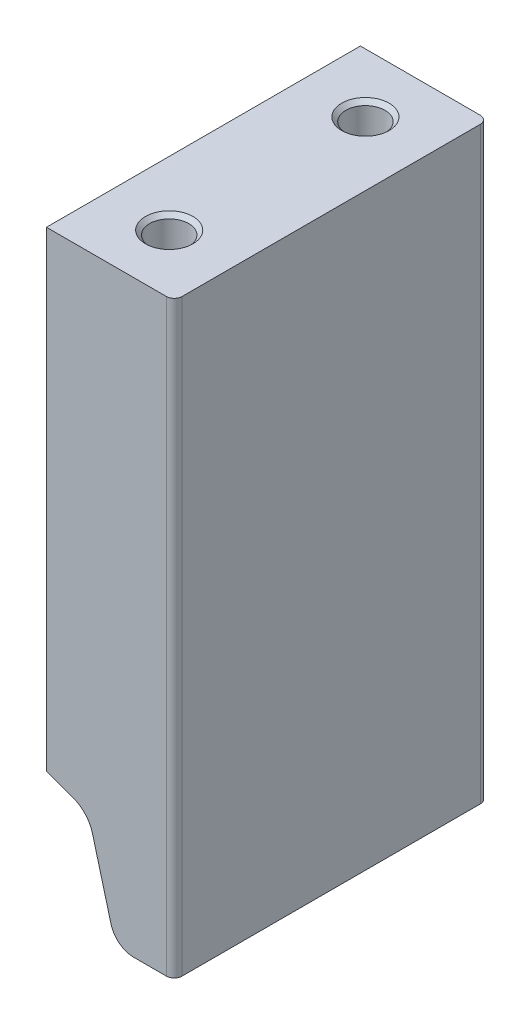
ISO-10303-21;
HEADER;
FILE_DESCRIPTION(('STEP AP214'),'2;1');
FILE_NAME('part.step','',(''),(''),'','','');
FILE_SCHEMA(('AUTOMOTIVE_DESIGN { 1 0 10303 214 1 1 1 1 }'));
ENDSEC;
DATA;
#1=APPLICATION_CONTEXT('core data for automotive mechanical design processes');
#2=APPLICATION_PROTOCOL_DEFINITION('international standard','automotive_design',2000,#1);
#3=PRODUCT_CONTEXT('',#1,'mechanical');
#4=PRODUCT('Part','Part','',(#3));
#5=PRODUCT_RELATED_PRODUCT_CATEGORY('part','',(#4));
#6=PRODUCT_DEFINITION_FORMATION('','',#4);
#7=PRODUCT_DEFINITION_CONTEXT('part definition',#1,'design');
#8=PRODUCT_DEFINITION('design','',#6,#7);
#9=PRODUCT_DEFINITION_SHAPE('','',#8);
#10=(LENGTH_UNIT() NAMED_UNIT(*) SI_UNIT(.MILLI.,.METRE.));
#11=(NAMED_UNIT(*) PLANE_ANGLE_UNIT() SI_UNIT($,.RADIAN.));
#12=(NAMED_UNIT(*) SI_UNIT($,.STERADIAN.) SOLID_ANGLE_UNIT());
#13=UNCERTAINTY_MEASURE_WITH_UNIT(LENGTH_MEASURE(1.E-05),#10,'distance_accuracy_value','');
#14=(GEOMETRIC_REPRESENTATION_CONTEXT(3) GLOBAL_UNCERTAINTY_ASSIGNED_CONTEXT((#13)) GLOBAL_UNIT_ASSIGNED_CONTEXT((#10,
#11,#12)) REPRESENTATION_CONTEXT('',''));
#15=CARTESIAN_POINT('',(0.,0.,0.));
#16=DIRECTION('',(0.,0.,1.));
#17=DIRECTION('',(1.,0.,0.));
#18=AXIS2_PLACEMENT_3D('',#15,#16,#17);
#19=CARTESIAN_POINT('',(8.14,-75.,20.));
#20=DIRECTION('',(1.,0.,0.));
#21=DIRECTION('',(0.,0.,-1.));
#22=AXIS2_PLACEMENT_3D('',#19,#20,#21);
#23=PLANE('',#22);
#24=DIRECTION('',(0.,0.,-1.));
#25=VECTOR('',#24,1.);
#26=CARTESIAN_POINT('',(8.14,-75.,20.));
#27=LINE('',#26,#25);
#28=CARTESIAN_POINT('',(8.14,-75.,19.));
#29=VERTEX_POINT('',#28);
#30=CARTESIAN_POINT('',(8.14,-75.,-19.));
#31=VERTEX_POINT('',#30);
#32=EDGE_CURVE('E215',#29,#31,#27,.T.);
#33=ORIENTED_EDGE('',*,*,#32,.T.);
#34=DIRECTION('',(0.,1.,0.));
#35=VECTOR('',#34,1.);
#36=CARTESIAN_POINT('',(8.14,-75.,-19.));
#37=LINE('',#36,#35);
#38=CARTESIAN_POINT('',(8.14,0.,-19.));
#39=VERTEX_POINT('',#38);
#40=EDGE_CURVE('E263',#31,#39,#37,.T.);
#41=ORIENTED_EDGE('',*,*,#40,.T.);
#42=DIRECTION('',(0.,0.,-1.));
#43=VECTOR('',#42,1.);
#44=CARTESIAN_POINT('',(8.14,0.,20.));
#45=LINE('',#44,#43);
#46=CARTESIAN_POINT('',(8.14,0.,19.));
#47=VERTEX_POINT('',#46);
#48=EDGE_CURVE('E208',#47,#39,#45,.T.);
#49=ORIENTED_EDGE('',*,*,#48,.F.);
#50=DIRECTION('',(0.,1.,0.));
#51=VECTOR('',#50,1.);
#52=CARTESIAN_POINT('',(8.14,-75.,19.));
#53=LINE('',#52,#51);
#54=EDGE_CURVE('E260',#47,#29,#53,.F.);
#55=ORIENTED_EDGE('',*,*,#54,.T.);
#56=EDGE_LOOP('',(#33,#41,#49,#55));
#57=FACE_BOUND('',#56,.T.);
#58=ADVANCED_FACE('F65',(#57),#23,.T.);
#59=CARTESIAN_POINT('',(-8.14,-75.,20.));
#60=DIRECTION('',(0.,0.,1.));
#61=DIRECTION('',(1.,0.,0.));
#62=AXIS2_PLACEMENT_3D('',#59,#60,#61);
#63=PLANE('',#62);
#64=DIRECTION('',(1.,0.,0.));
#65=VECTOR('',#64,1.);
#66=CARTESIAN_POINT('',(-8.14,-75.,20.));
#67=LINE('',#66,#65);
#68=CARTESIAN_POINT('',(2.98257760988845,-75.,20.));
#69=VERTEX_POINT('',#68);
#70=CARTESIAN_POINT('',(7.14,-75.,20.));
#71=VERTEX_POINT('',#70);
#72=EDGE_CURVE('E223',#69,#71,#67,.T.);
#73=ORIENTED_EDGE('',*,*,#72,.T.);
#74=DIRECTION('',(0.,1.,0.));
#75=VECTOR('',#74,1.);
#76=CARTESIAN_POINT('',(7.14,-75.,20.));
#77=LINE('',#76,#75);
#78=CARTESIAN_POINT('',(7.14,0.,20.));
#79=VERTEX_POINT('',#78);
#80=EDGE_CURVE('E13',#71,#79,#77,.T.);
#81=ORIENTED_EDGE('',*,*,#80,.T.);
#82=DIRECTION('',(1.,0.,0.));
#83=VECTOR('',#82,1.);
#84=CARTESIAN_POINT('',(-8.14,0.,20.));
#85=LINE('',#84,#83);
#86=CARTESIAN_POINT('',(-8.14,0.,20.));
#87=VERTEX_POINT('',#86);
#88=EDGE_CURVE('E220',#87,#79,#85,.T.);
#89=ORIENTED_EDGE('',*,*,#88,.F.);
#90=DIRECTION('',(0.,1.,0.));
#91=VECTOR('',#90,1.);
#92=CARTESIAN_POINT('',(-8.14,-75.,20.));
#93=LINE('',#92,#91);
#94=CARTESIAN_POINT('',(-8.14,-60.015348441564,20.));
#95=VERTEX_POINT('',#94);
#96=EDGE_CURVE('E240',#95,#87,#93,.T.);
#97=ORIENTED_EDGE('',*,*,#96,.F.);
#98=DIRECTION('',(-0.939692620785908,0.342020143325669,0.));
#99=VECTOR('',#98,1.);
#100=CARTESIAN_POINT('',(-4.77191942669732,-61.2412295168564,20.));
#101=LINE('',#100,#99);
#102=CARTESIAN_POINT('',(-4.77191942669732,-61.2412295168564,20.));
#103=VERTEX_POINT('',#102);
#104=EDGE_CURVE('E200',#103,#95,#101,.T.);
#105=ORIENTED_EDGE('',*,*,#104,.F.);
#106=CARTESIAN_POINT('',(-6.14,-65.,20.));
#107=DIRECTION('',(0.,0.,1.));
#108=DIRECTION('',(1.,0.,0.));
#109=AXIS2_PLACEMENT_3D('',#106,#107,#108);
#110=CIRCLE('',#109,4.);
#111=CARTESIAN_POINT('',(-2.27629669484373,-63.9647238195899,20.));
#112=VERTEX_POINT('',#111);
#113=EDGE_CURVE('E196',#112,#103,#110,.T.);
#114=ORIENTED_EDGE('',*,*,#113,.F.);
#115=DIRECTION('',(-0.258819045102522,0.965925826289068,0.));
#116=VECTOR('',#115,1.);
#117=CARTESIAN_POINT('',(-2.27629669484373,-63.9647238195899,20.));
#118=LINE('',#117,#116);
#119=CARTESIAN_POINT('',(0.0848001310212432,-72.7764571353076,20.));
#120=VERTEX_POINT('',#119);
#121=EDGE_CURVE('E193',#120,#112,#118,.T.);
#122=ORIENTED_EDGE('',*,*,#121,.F.);
#123=CARTESIAN_POINT('',(2.98257760988845,-72.,20.));
#124=DIRECTION('',(0.,0.,1.));
#125=DIRECTION('',(1.,0.,0.));
#126=AXIS2_PLACEMENT_3D('',#123,#124,#125);
#127=CIRCLE('',#126,3.);
#128=EDGE_CURVE('E250',#120,#69,#127,.T.);
#129=ORIENTED_EDGE('',*,*,#128,.T.);
#130=EDGE_LOOP('',(#73,#81,#89,#97,#105,#114,#122,#129));
#131=FACE_BOUND('',#130,.T.);
#132=ADVANCED_FACE('F296',(#131),#63,.T.);
#133=CARTESIAN_POINT('',(-8.14,-75.,20.));
#134=DIRECTION('',(-1.,0.,0.));
#135=DIRECTION('',(0.,0.,1.));
#136=AXIS2_PLACEMENT_3D('',#133,#134,#135);
#137=PLANE('',#136);
#138=DIRECTION('',(0.,0.,1.));
#139=VECTOR('',#138,1.);
#140=CARTESIAN_POINT('',(-8.14,-60.015348441564,-20.001));
#141=LINE('',#140,#139);
#142=CARTESIAN_POINT('',(-8.14,-60.015348441564,-20.));
#143=VERTEX_POINT('',#142);
#144=EDGE_CURVE('E204',#143,#95,#141,.T.);
#145=ORIENTED_EDGE('',*,*,#144,.T.);
#146=ORIENTED_EDGE('',*,*,#96,.T.);
#147=DIRECTION('',(0.,0.,1.));
#148=VECTOR('',#147,1.);
#149=CARTESIAN_POINT('',(-8.14,0.,20.));
#150=LINE('',#149,#148);
#151=CARTESIAN_POINT('',(-8.14,0.,-20.));
#152=VERTEX_POINT('',#151);
#153=EDGE_CURVE('E233',#152,#87,#150,.T.);
#154=ORIENTED_EDGE('',*,*,#153,.F.);
#155=DIRECTION('',(0.,1.,0.));
#156=VECTOR('',#155,1.);
#157=CARTESIAN_POINT('',(-8.14,-75.,-20.));
#158=LINE('',#157,#156);
#159=EDGE_CURVE('E226',#143,#152,#158,.T.);
#160=ORIENTED_EDGE('',*,*,#159,.F.);
#161=EDGE_LOOP('',(#145,#146,#154,#160));
#162=FACE_BOUND('',#161,.T.);
#163=ADVANCED_FACE('F292',(#162),#137,.T.);
#164=CARTESIAN_POINT('',(-8.14,-75.,-20.));
#165=DIRECTION('',(0.,0.,-1.));
#166=DIRECTION('',(-1.,0.,0.));
#167=AXIS2_PLACEMENT_3D('',#164,#165,#166);
#168=PLANE('',#167);
#169=DIRECTION('',(-1.,0.,0.));
#170=VECTOR('',#169,1.);
#171=CARTESIAN_POINT('',(-8.14,0.,-20.));
#172=LINE('',#171,#170);
#173=CARTESIAN_POINT('',(7.14,0.,-20.));
#174=VERTEX_POINT('',#173);
#175=EDGE_CURVE('E230',#174,#152,#172,.T.);
#176=ORIENTED_EDGE('',*,*,#175,.F.);
#177=DIRECTION('',(0.,1.,0.));
#178=VECTOR('',#177,1.);
#179=CARTESIAN_POINT('',(7.14,-75.,-20.));
#180=LINE('',#179,#178);
#181=CARTESIAN_POINT('',(7.14,-75.,-20.));
#182=VERTEX_POINT('',#181);
#183=EDGE_CURVE('E89',#174,#182,#180,.F.);
#184=ORIENTED_EDGE('',*,*,#183,.T.);
#185=DIRECTION('',(-1.,0.,0.));
#186=VECTOR('',#185,1.);
#187=CARTESIAN_POINT('',(-8.14,-75.,-20.));
#188=LINE('',#187,#186);
#189=CARTESIAN_POINT('',(2.98257760988845,-75.,-20.));
#190=VERTEX_POINT('',#189);
#191=EDGE_CURVE('E219',#182,#190,#188,.T.);
#192=ORIENTED_EDGE('',*,*,#191,.T.);
#193=CARTESIAN_POINT('',(2.98257760988845,-72.,-20.));
#194=DIRECTION('',(0.,0.,-1.));
#195=DIRECTION('',(-1.,0.,0.));
#196=AXIS2_PLACEMENT_3D('',#193,#194,#195);
#197=CIRCLE('',#196,3.);
#198=CARTESIAN_POINT('',(0.0848001310212432,-72.7764571353076,-20.));
#199=VERTEX_POINT('',#198);
#200=EDGE_CURVE('E257',#190,#199,#197,.T.);
#201=ORIENTED_EDGE('',*,*,#200,.T.);
#202=DIRECTION('',(-0.258819045102522,0.965925826289068,0.));
#203=VECTOR('',#202,1.);
#204=CARTESIAN_POINT('',(-2.27629669484373,-63.9647238195899,-20.));
#205=LINE('',#204,#203);
#206=CARTESIAN_POINT('',(-2.27629669484373,-63.9647238195899,-20.));
#207=VERTEX_POINT('',#206);
#208=EDGE_CURVE('E182',#199,#207,#205,.T.);
#209=ORIENTED_EDGE('',*,*,#208,.T.);
#210=CARTESIAN_POINT('',(-6.14,-65.,-20.));
#211=DIRECTION('',(0.,0.,-1.));
#212=DIRECTION('',(-1.,0.,0.));
#213=AXIS2_PLACEMENT_3D('',#210,#211,#212);
#214=CIRCLE('',#213,4.);
#215=CARTESIAN_POINT('',(-4.77191942669732,-61.2412295168564,-20.));
#216=VERTEX_POINT('',#215);
#217=EDGE_CURVE('E185',#207,#216,#214,.F.);
#218=ORIENTED_EDGE('',*,*,#217,.T.);
#219=DIRECTION('',(-0.939692620785908,0.342020143325669,0.));
#220=VECTOR('',#219,1.);
#221=CARTESIAN_POINT('',(-4.77191942669732,-61.2412295168564,-20.));
#222=LINE('',#221,#220);
#223=EDGE_CURVE('E189',#216,#143,#222,.T.);
#224=ORIENTED_EDGE('',*,*,#223,.T.);
#225=ORIENTED_EDGE('',*,*,#159,.T.);
#226=EDGE_LOOP('',(#176,#184,#192,#201,#209,#218,#224,#225));
#227=FACE_BOUND('',#226,.T.);
#228=ADVANCED_FACE('F288',(#227),#168,.T.);
#229=CARTESIAN_POINT('',(0.,-75.,0.));
#230=DIRECTION('',(0.,-1.,0.));
#231=DIRECTION('',(0.,0.,-1.));
#232=AXIS2_PLACEMENT_3D('',#229,#230,#231);
#233=PLANE('',#232);
#234=ORIENTED_EDGE('',*,*,#191,.F.);
#235=CARTESIAN_POINT('',(7.14,-75.,-19.));
#236=DIRECTION('',(0.,-1.,0.));
#237=DIRECTION('',(0.,0.,-1.));
#238=AXIS2_PLACEMENT_3D('',#235,#236,#237);
#239=CIRCLE('',#238,1.);
#240=EDGE_CURVE('E74',#182,#31,#239,.T.);
#241=ORIENTED_EDGE('',*,*,#240,.T.);
#242=ORIENTED_EDGE('',*,*,#32,.F.);
#243=CARTESIAN_POINT('',(7.14,-75.,19.));
#244=DIRECTION('',(0.,-1.,0.));
#245=DIRECTION('',(0.,0.,-1.));
#246=AXIS2_PLACEMENT_3D('',#243,#244,#245);
#247=CIRCLE('',#246,1.);
#248=EDGE_CURVE('E81',#29,#71,#247,.T.);
#249=ORIENTED_EDGE('',*,*,#248,.T.);
#250=ORIENTED_EDGE('',*,*,#72,.F.);
#251=DIRECTION('',(0.,0.,1.));
#252=VECTOR('',#251,1.);
#253=CARTESIAN_POINT('',(2.98257760988845,-75.,-20.));
#254=LINE('',#253,#252);
#255=EDGE_CURVE('E253',#69,#190,#254,.F.);
#256=ORIENTED_EDGE('',*,*,#255,.T.);
#257=EDGE_LOOP('',(#234,#241,#242,#249,#250,#256));
#258=FACE_BOUND('',#257,.T.);
#259=ADVANCED_FACE('F279',(#258),#233,.T.);
#260=CARTESIAN_POINT('',(0.,0.,0.));
#261=DIRECTION('',(0.,-1.,0.));
#262=DIRECTION('',(0.,0.,-1.));
#263=AXIS2_PLACEMENT_3D('',#260,#261,#262);
#264=PLANE('',#263);
#265=CARTESIAN_POINT('',(0.,0.,-12.5));
#266=DIRECTION('',(0.,1.,0.));
#267=DIRECTION('',(0.,0.,1.));
#268=AXIS2_PLACEMENT_3D('',#265,#266,#267);
#269=CIRCLE('',#268,3.025);
#270=CARTESIAN_POINT('',(0.,0.,-9.475));
#271=VERTEX_POINT('',#270);
#272=EDGE_CURVE('E171',#271,#271,#269,.T.);
#273=ORIENTED_EDGE('',*,*,#272,.F.);
#274=EDGE_LOOP('',(#273));
#275=FACE_BOUND('',#274,.T.);
#276=CARTESIAN_POINT('',(0.,0.,12.5));
#277=DIRECTION('',(0.,1.,0.));
#278=DIRECTION('',(0.,0.,1.));
#279=AXIS2_PLACEMENT_3D('',#276,#277,#278);
#280=CIRCLE('',#279,3.025);
#281=CARTESIAN_POINT('',(0.,0.,15.525));
#282=VERTEX_POINT('',#281);
#283=EDGE_CURVE('E161',#282,#282,#280,.T.);
#284=ORIENTED_EDGE('',*,*,#283,.F.);
#285=EDGE_LOOP('',(#284));
#286=FACE_BOUND('',#285,.T.);
#287=ORIENTED_EDGE('',*,*,#48,.T.);
#288=CARTESIAN_POINT('',(7.14,0.,-19.));
#289=DIRECTION('',(0.,-1.,0.));
#290=DIRECTION('',(0.,0.,-1.));
#291=AXIS2_PLACEMENT_3D('',#288,#289,#290);
#292=CIRCLE('',#291,1.);
#293=EDGE_CURVE('E270',#39,#174,#292,.F.);
#294=ORIENTED_EDGE('',*,*,#293,.T.);
#295=ORIENTED_EDGE('',*,*,#175,.T.);
#296=ORIENTED_EDGE('',*,*,#153,.T.);
#297=ORIENTED_EDGE('',*,*,#88,.T.);
#298=CARTESIAN_POINT('',(7.14,0.,19.));
#299=DIRECTION('',(0.,-1.,0.));
#300=DIRECTION('',(0.,0.,-1.));
#301=AXIS2_PLACEMENT_3D('',#298,#299,#300);
#302=CIRCLE('',#301,1.);
#303=EDGE_CURVE('E267',#79,#47,#302,.F.);
#304=ORIENTED_EDGE('',*,*,#303,.T.);
#305=EDGE_LOOP('',(#287,#294,#295,#296,#297,#304));
#306=FACE_BOUND('',#305,.T.);
#307=ADVANCED_FACE('F287',(#275,#286,#306),#264,.F.);
#308=CARTESIAN_POINT('',(-4.77191942669732,-61.2412295168564,-20.001));
#309=DIRECTION('',(0.342020143325669,0.939692620785908,0.));
#310=DIRECTION('',(-0.939692620785908,0.342020143325669,0.));
#311=AXIS2_PLACEMENT_3D('',#308,#309,#310);
#312=PLANE('',#311);
#313=DIRECTION('',(0.,0.,1.));
#314=VECTOR('',#313,1.);
#315=CARTESIAN_POINT('',(-4.77191942669732,-61.2412295168564,-20.001));
#316=LINE('',#315,#314);
#317=EDGE_CURVE('E209',#216,#103,#316,.T.);
#318=ORIENTED_EDGE('',*,*,#317,.T.);
#319=ORIENTED_EDGE('',*,*,#104,.T.);
#320=ORIENTED_EDGE('',*,*,#144,.F.);
#321=ORIENTED_EDGE('',*,*,#223,.F.);
#322=EDGE_LOOP('',(#318,#319,#320,#321));
#323=FACE_BOUND('',#322,.T.);
#324=ADVANCED_FACE('F340',(#323),#312,.F.);
#325=CARTESIAN_POINT('',(-6.14,-65.,-20.001));
#326=DIRECTION('',(0.,0.,1.));
#327=DIRECTION('',(1.,0.,0.));
#328=AXIS2_PLACEMENT_3D('',#325,#326,#327);
#329=CYLINDRICAL_SURFACE('',#328,4.);
#330=DIRECTION('',(0.,0.,1.));
#331=VECTOR('',#330,1.);
#332=CARTESIAN_POINT('',(-2.27629669484373,-63.9647238195899,-20.001));
#333=LINE('',#332,#331);
#334=EDGE_CURVE('E203',#207,#112,#333,.T.);
#335=ORIENTED_EDGE('',*,*,#334,.T.);
#336=ORIENTED_EDGE('',*,*,#113,.T.);
#337=ORIENTED_EDGE('',*,*,#317,.F.);
#338=ORIENTED_EDGE('',*,*,#217,.F.);
#339=EDGE_LOOP('',(#335,#336,#337,#338));
#340=FACE_BOUND('',#339,.T.);
#341=ADVANCED_FACE('F326',(#340),#329,.F.);
#342=CARTESIAN_POINT('',(-2.27629669484373,-63.9647238195899,-20.001));
#343=DIRECTION('',(0.965925826289068,0.258819045102522,0.));
#344=DIRECTION('',(-0.258819045102522,0.965925826289068,0.));
#345=AXIS2_PLACEMENT_3D('',#342,#343,#344);
#346=PLANE('',#345);
#347=ORIENTED_EDGE('',*,*,#208,.F.);
#348=DIRECTION('',(0.,0.,1.));
#349=VECTOR('',#348,1.);
#350=CARTESIAN_POINT('',(0.0848001310212428,-72.7764571353076,20.));
#351=LINE('',#350,#349);
#352=EDGE_CURVE('E243',#199,#120,#351,.T.);
#353=ORIENTED_EDGE('',*,*,#352,.T.);
#354=ORIENTED_EDGE('',*,*,#121,.T.);
#355=ORIENTED_EDGE('',*,*,#334,.F.);
#356=EDGE_LOOP('',(#347,#353,#354,#355));
#357=FACE_BOUND('',#356,.T.);
#358=ADVANCED_FACE('F321',(#357),#346,.F.);
#359=CARTESIAN_POINT('',(2.98257760988845,-72.,-20.001));
#360=DIRECTION('',(0.,0.,-1.));
#361=DIRECTION('',(-1.,0.,0.));
#362=AXIS2_PLACEMENT_3D('',#359,#360,#361);
#363=CYLINDRICAL_SURFACE('',#362,3.);
#364=ORIENTED_EDGE('',*,*,#200,.F.);
#365=ORIENTED_EDGE('',*,*,#255,.F.);
#366=ORIENTED_EDGE('',*,*,#128,.F.);
#367=ORIENTED_EDGE('',*,*,#352,.F.);
#368=EDGE_LOOP('',(#364,#365,#366,#367));
#369=FACE_BOUND('',#368,.T.);
#370=ADVANCED_FACE('F310',(#369),#363,.T.);
#371=CARTESIAN_POINT('',(7.14,-75.,-19.));
#372=DIRECTION('',(0.,1.,0.));
#373=DIRECTION('',(0.,0.,1.));
#374=AXIS2_PLACEMENT_3D('',#371,#372,#373);
#375=CYLINDRICAL_SURFACE('',#374,1.);
#376=ORIENTED_EDGE('',*,*,#240,.F.);
#377=ORIENTED_EDGE('',*,*,#183,.F.);
#378=ORIENTED_EDGE('',*,*,#293,.F.);
#379=ORIENTED_EDGE('',*,*,#40,.F.);
#380=EDGE_LOOP('',(#376,#377,#378,#379));
#381=FACE_BOUND('',#380,.T.);
#382=ADVANCED_FACE('F285',(#381),#375,.T.);
#383=CARTESIAN_POINT('',(7.14,-75.,19.));
#384=DIRECTION('',(0.,1.,0.));
#385=DIRECTION('',(0.,0.,1.));
#386=AXIS2_PLACEMENT_3D('',#383,#384,#385);
#387=CYLINDRICAL_SURFACE('',#386,1.);
#388=ORIENTED_EDGE('',*,*,#248,.F.);
#389=ORIENTED_EDGE('',*,*,#54,.F.);
#390=ORIENTED_EDGE('',*,*,#303,.F.);
#391=ORIENTED_EDGE('',*,*,#80,.F.);
#392=EDGE_LOOP('',(#388,#389,#390,#391));
#393=FACE_BOUND('',#392,.T.);
#394=ADVANCED_FACE('F67',(#393),#387,.T.);
#395=CARTESIAN_POINT('',(0.,-17.,12.5));
#396=DIRECTION('',(0.,1.,0.));
#397=DIRECTION('',(0.,0.,1.));
#398=AXIS2_PLACEMENT_3D('',#395,#396,#397);
#399=CONICAL_SURFACE('',#398,2.49999999999999,1.02974425867665);
#400=CARTESIAN_POINT('',(0.,-18.5021515475689,12.5));
#401=VERTEX_POINT('',#400);
#402=VERTEX_LOOP('',#401);
#403=FACE_BOUND('',#402,.T.);
#404=CARTESIAN_POINT('',(0.,-17.,12.5));
#405=DIRECTION('',(0.,1.,0.));
#406=DIRECTION('',(0.,0.,1.));
#407=AXIS2_PLACEMENT_3D('',#404,#405,#406);
#408=CIRCLE('',#407,2.49999999999999);
#409=CARTESIAN_POINT('',(0.,-17.,15.));
#410=VERTEX_POINT('',#409);
#411=EDGE_CURVE('E178',#410,#410,#408,.T.);
#412=ORIENTED_EDGE('',*,*,#411,.T.);
#413=EDGE_LOOP('',(#412));
#414=FACE_BOUND('',#413,.T.);
#415=ADVANCED_FACE('F301',(#403,#414),#399,.F.);
#416=CARTESIAN_POINT('',(0.,0.,12.5));
#417=DIRECTION('',(0.,1.,0.));
#418=DIRECTION('',(0.,0.,1.));
#419=AXIS2_PLACEMENT_3D('',#416,#417,#418);
#420=CYLINDRICAL_SURFACE('',#419,2.49999999999999);
#421=ORIENTED_EDGE('',*,*,#411,.F.);
#422=EDGE_LOOP('',(#421));
#423=FACE_BOUND('',#422,.T.);
#424=CARTESIAN_POINT('',(0.,-0.525000000000012,12.5));
#425=DIRECTION('',(0.,1.,0.));
#426=DIRECTION('',(0.,0.,1.));
#427=AXIS2_PLACEMENT_3D('',#424,#425,#426);
#428=CIRCLE('',#427,2.49999999999999);
#429=CARTESIAN_POINT('',(0.,-0.525000000000012,15.));
#430=VERTEX_POINT('',#429);
#431=EDGE_CURVE('E168',#430,#430,#428,.T.);
#432=ORIENTED_EDGE('',*,*,#431,.T.);
#433=EDGE_LOOP('',(#432));
#434=FACE_BOUND('',#433,.T.);
#435=ADVANCED_FACE('F307',(#423,#434),#420,.F.);
#436=CARTESIAN_POINT('',(0.,0.,12.5));
#437=DIRECTION('',(0.,1.,0.));
#438=DIRECTION('',(0.,0.,1.));
#439=AXIS2_PLACEMENT_3D('',#436,#437,#438);
#440=CONICAL_SURFACE('',#439,3.025,0.785398163397445);
#441=ORIENTED_EDGE('',*,*,#431,.F.);
#442=EDGE_LOOP('',(#441));
#443=FACE_BOUND('',#442,.T.);
#444=ORIENTED_EDGE('',*,*,#283,.T.);
#445=EDGE_LOOP('',(#444));
#446=FACE_BOUND('',#445,.T.);
#447=ADVANCED_FACE('F154',(#443,#446),#440,.F.);
#448=CARTESIAN_POINT('',(0.,-17.,-12.5));
#449=DIRECTION('',(0.,1.,0.));
#450=DIRECTION('',(0.,0.,1.));
#451=AXIS2_PLACEMENT_3D('',#448,#449,#450);
#452=CONICAL_SURFACE('',#451,2.49999999999999,1.02974425867665);
#453=CARTESIAN_POINT('',(0.,-18.5021515475689,-12.5));
#454=VERTEX_POINT('',#453);
#455=VERTEX_LOOP('',#454);
#456=FACE_BOUND('',#455,.T.);
#457=CARTESIAN_POINT('',(0.,-17.,-12.5));
#458=DIRECTION('',(0.,1.,0.));
#459=DIRECTION('',(0.,0.,1.));
#460=AXIS2_PLACEMENT_3D('',#457,#458,#459);
#461=CIRCLE('',#460,2.49999999999999);
#462=CARTESIAN_POINT('',(0.,-17.,-10.));
#463=VERTEX_POINT('',#462);
#464=EDGE_CURVE('E158',#463,#463,#461,.T.);
#465=ORIENTED_EDGE('',*,*,#464,.T.);
#466=EDGE_LOOP('',(#465));
#467=FACE_BOUND('',#466,.T.);
#468=ADVANCED_FACE('F150',(#456,#467),#452,.F.);
#469=CARTESIAN_POINT('',(0.,0.,-12.5));
#470=DIRECTION('',(0.,1.,0.));
#471=DIRECTION('',(0.,0.,1.));
#472=AXIS2_PLACEMENT_3D('',#469,#470,#471);
#473=CYLINDRICAL_SURFACE('',#472,2.49999999999999);
#474=ORIENTED_EDGE('',*,*,#464,.F.);
#475=EDGE_LOOP('',(#474));
#476=FACE_BOUND('',#475,.T.);
#477=CARTESIAN_POINT('',(0.,-0.525000000000012,-12.5));
#478=DIRECTION('',(0.,1.,0.));
#479=DIRECTION('',(0.,0.,1.));
#480=AXIS2_PLACEMENT_3D('',#477,#478,#479);
#481=CIRCLE('',#480,2.49999999999999);
#482=CARTESIAN_POINT('',(0.,-0.525000000000012,-10.));
#483=VERTEX_POINT('',#482);
#484=EDGE_CURVE('E162',#483,#483,#481,.T.);
#485=ORIENTED_EDGE('',*,*,#484,.T.);
#486=EDGE_LOOP('',(#485));
#487=FACE_BOUND('',#486,.T.);
#488=ADVANCED_FACE('F153',(#476,#487),#473,.F.);
#489=CARTESIAN_POINT('',(0.,0.,-12.5));
#490=DIRECTION('',(0.,1.,0.));
#491=DIRECTION('',(0.,0.,1.));
#492=AXIS2_PLACEMENT_3D('',#489,#490,#491);
#493=CONICAL_SURFACE('',#492,3.025,0.785398163397445);
#494=ORIENTED_EDGE('',*,*,#484,.F.);
#495=EDGE_LOOP('',(#494));
#496=FACE_BOUND('',#495,.T.);
#497=ORIENTED_EDGE('',*,*,#272,.T.);
#498=EDGE_LOOP('',(#497));
#499=FACE_BOUND('',#498,.T.);
#500=ADVANCED_FACE('F423',(#496,#499),#493,.F.);
#501=CLOSED_SHELL('',(#58,#132,#163,#228,#259,#307,#324,#341,#358,#370,#382,#394,#415,#435,#447,
#468,#488,#500));
#502=MANIFOLD_SOLID_BREP('B2',#501);
#503=ADVANCED_BREP_SHAPE_REPRESENTATION('',(#18,#502),#14);
#504=SHAPE_DEFINITION_REPRESENTATION(#9,#503);
ENDSEC;
END-ISO-10303-21;
